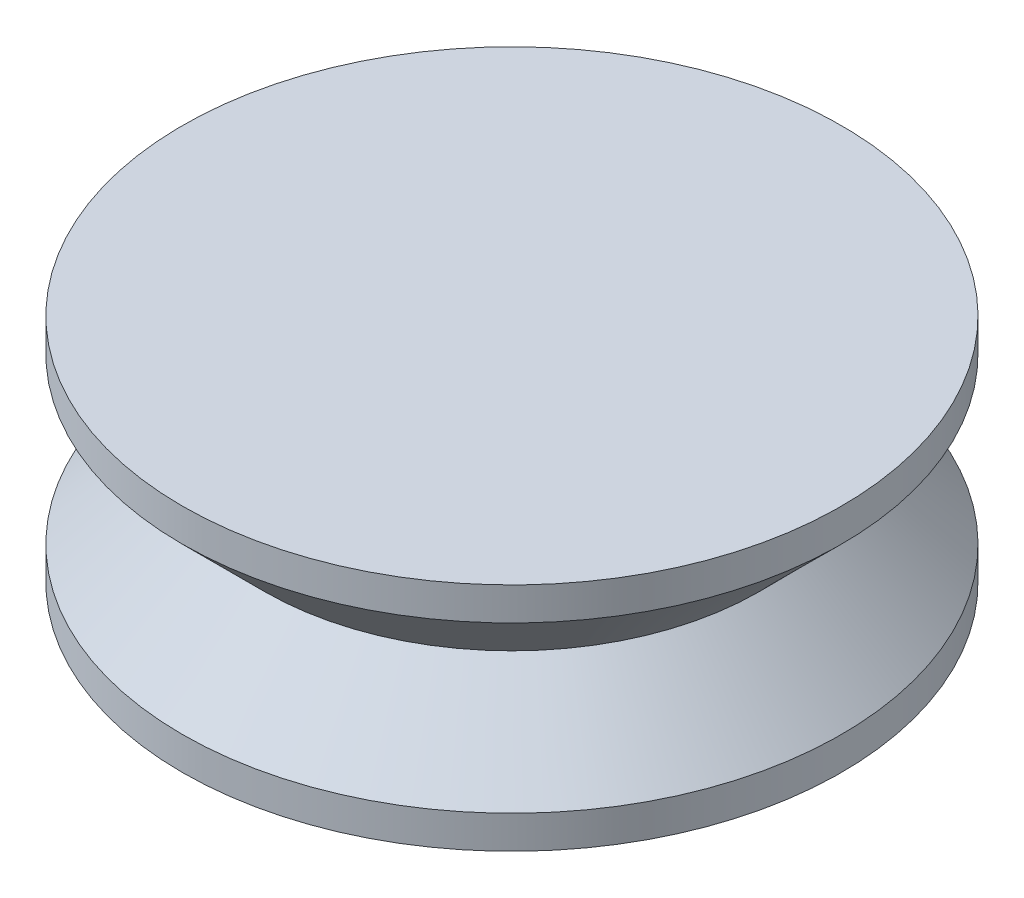
ISO-10303-21;
HEADER;
FILE_DESCRIPTION(('STEP AP214'),'2;1');
FILE_NAME('part.step','',(''),(''),'','','');
FILE_SCHEMA(('AUTOMOTIVE_DESIGN { 1 0 10303 214 1 1 1 1 }'));
ENDSEC;
DATA;
#1=APPLICATION_CONTEXT('core data for automotive mechanical design processes');
#2=APPLICATION_PROTOCOL_DEFINITION('international standard','automotive_design',2000,#1);
#3=PRODUCT_CONTEXT('',#1,'mechanical');
#4=PRODUCT('Part','Part','',(#3));
#5=PRODUCT_RELATED_PRODUCT_CATEGORY('part','',(#4));
#6=PRODUCT_DEFINITION_FORMATION('','',#4);
#7=PRODUCT_DEFINITION_CONTEXT('part definition',#1,'design');
#8=PRODUCT_DEFINITION('design','',#6,#7);
#9=PRODUCT_DEFINITION_SHAPE('','',#8);
#10=(LENGTH_UNIT() NAMED_UNIT(*) SI_UNIT(.MILLI.,.METRE.));
#11=(NAMED_UNIT(*) PLANE_ANGLE_UNIT() SI_UNIT($,.RADIAN.));
#12=(NAMED_UNIT(*) SI_UNIT($,.STERADIAN.) SOLID_ANGLE_UNIT());
#13=UNCERTAINTY_MEASURE_WITH_UNIT(LENGTH_MEASURE(1.E-05),#10,'distance_accuracy_value','');
#14=(GEOMETRIC_REPRESENTATION_CONTEXT(3) GLOBAL_UNCERTAINTY_ASSIGNED_CONTEXT((#13)) GLOBAL_UNIT_ASSIGNED_CONTEXT((#10,
#11,#12)) REPRESENTATION_CONTEXT('',''));
#15=CARTESIAN_POINT('',(0.,0.,0.));
#16=DIRECTION('',(0.,0.,1.));
#17=DIRECTION('',(1.,0.,0.));
#18=AXIS2_PLACEMENT_3D('',#15,#16,#17);
#19=CARTESIAN_POINT('',(12.7,4.445,0.));
#20=DIRECTION('',(0.,-1.,0.));
#21=DIRECTION('',(0.,0.,-1.));
#22=AXIS2_PLACEMENT_3D('',#19,#20,#21);
#23=PLANE('',#22);
#24=CARTESIAN_POINT('',(0.,4.445,0.));
#25=DIRECTION('',(0.,1.,0.));
#26=DIRECTION('',(0.,0.,1.));
#27=AXIS2_PLACEMENT_3D('',#24,#25,#26);
#28=CIRCLE('',#27,12.7);
#29=CARTESIAN_POINT('',(0.,4.445,12.7));
#30=VERTEX_POINT('',#29);
#31=EDGE_CURVE('E53',#30,#30,#28,.T.);
#32=ORIENTED_EDGE('',*,*,#31,.T.);
#33=EDGE_LOOP('',(#32));
#34=FACE_BOUND('',#33,.T.);
#35=ADVANCED_FACE('F34',(#34),#23,.F.);
#36=CARTESIAN_POINT('',(0.,-4.445,0.));
#37=DIRECTION('',(0.,1.,0.));
#38=DIRECTION('',(0.,0.,1.));
#39=AXIS2_PLACEMENT_3D('',#36,#37,#38);
#40=PLANE('',#39);
#41=CARTESIAN_POINT('',(0.,-4.445,0.));
#42=DIRECTION('',(0.,1.,0.));
#43=DIRECTION('',(0.,0.,1.));
#44=AXIS2_PLACEMENT_3D('',#41,#42,#43);
#45=CIRCLE('',#44,12.7);
#46=CARTESIAN_POINT('',(0.,-4.445,12.7));
#47=VERTEX_POINT('',#46);
#48=EDGE_CURVE('E10',#47,#47,#45,.T.);
#49=ORIENTED_EDGE('',*,*,#48,.F.);
#50=EDGE_LOOP('',(#49));
#51=FACE_BOUND('',#50,.T.);
#52=ADVANCED_FACE('F77',(#51),#40,.F.);
#53=CARTESIAN_POINT('',(0.,4.445,0.));
#54=DIRECTION('',(0.,1.,0.));
#55=DIRECTION('',(0.,0.,1.));
#56=AXIS2_PLACEMENT_3D('',#53,#54,#55);
#57=CYLINDRICAL_SURFACE('',#56,12.7);
#58=CARTESIAN_POINT('',(0.,-3.175,0.));
#59=DIRECTION('',(0.,1.,0.));
#60=DIRECTION('',(0.,0.,1.));
#61=AXIS2_PLACEMENT_3D('',#58,#59,#60);
#62=CIRCLE('',#61,12.7);
#63=CARTESIAN_POINT('',(0.,-3.175,12.7));
#64=VERTEX_POINT('',#63);
#65=EDGE_CURVE('E40',#64,#64,#62,.T.);
#66=ORIENTED_EDGE('',*,*,#65,.F.);
#67=EDGE_LOOP('',(#66));
#68=FACE_BOUND('',#67,.T.);
#69=ORIENTED_EDGE('',*,*,#48,.T.);
#70=EDGE_LOOP('',(#69));
#71=FACE_BOUND('',#70,.T.);
#72=ADVANCED_FACE('F72',(#68,#71),#57,.T.);
#73=CARTESIAN_POINT('',(0.,-3.175,0.));
#74=DIRECTION('',(0.,-1.,0.));
#75=DIRECTION('',(0.,0.,-1.));
#76=AXIS2_PLACEMENT_3D('',#73,#74,#75);
#77=CONICAL_SURFACE('',#76,12.7,0.785398163397449);
#78=CARTESIAN_POINT('',(0.,0.,0.));
#79=DIRECTION('',(0.,1.,0.));
#80=DIRECTION('',(0.,0.,1.));
#81=AXIS2_PLACEMENT_3D('',#78,#79,#80);
#82=CIRCLE('',#81,9.525);
#83=CARTESIAN_POINT('',(0.,0.,9.525));
#84=VERTEX_POINT('',#83);
#85=EDGE_CURVE('E44',#84,#84,#82,.T.);
#86=ORIENTED_EDGE('',*,*,#85,.F.);
#87=EDGE_LOOP('',(#86));
#88=FACE_BOUND('',#87,.T.);
#89=ORIENTED_EDGE('',*,*,#65,.T.);
#90=EDGE_LOOP('',(#89));
#91=FACE_BOUND('',#90,.T.);
#92=ADVANCED_FACE('F67',(#88,#91),#77,.T.);
#93=CARTESIAN_POINT('',(0.,0.,0.));
#94=DIRECTION('',(0.,1.,0.));
#95=DIRECTION('',(0.,0.,1.));
#96=AXIS2_PLACEMENT_3D('',#93,#94,#95);
#97=CONICAL_SURFACE('',#96,9.525,0.785398163397448);
#98=CARTESIAN_POINT('',(0.,3.175,0.));
#99=DIRECTION('',(0.,1.,0.));
#100=DIRECTION('',(0.,0.,1.));
#101=AXIS2_PLACEMENT_3D('',#98,#99,#100);
#102=CIRCLE('',#101,12.7);
#103=CARTESIAN_POINT('',(0.,3.175,12.7));
#104=VERTEX_POINT('',#103);
#105=EDGE_CURVE('E48',#104,#104,#102,.T.);
#106=ORIENTED_EDGE('',*,*,#105,.F.);
#107=EDGE_LOOP('',(#106));
#108=FACE_BOUND('',#107,.T.);
#109=ORIENTED_EDGE('',*,*,#85,.T.);
#110=EDGE_LOOP('',(#109));
#111=FACE_BOUND('',#110,.T.);
#112=ADVANCED_FACE('F61',(#108,#111),#97,.T.);
#113=CARTESIAN_POINT('',(0.,4.445,0.));
#114=DIRECTION('',(0.,1.,0.));
#115=DIRECTION('',(0.,0.,1.));
#116=AXIS2_PLACEMENT_3D('',#113,#114,#115);
#117=CYLINDRICAL_SURFACE('',#116,12.7);
#118=ORIENTED_EDGE('',*,*,#31,.F.);
#119=EDGE_LOOP('',(#118));
#120=FACE_BOUND('',#119,.T.);
#121=ORIENTED_EDGE('',*,*,#105,.T.);
#122=EDGE_LOOP('',(#121));
#123=FACE_BOUND('',#122,.T.);
#124=ADVANCED_FACE('F58',(#120,#123),#117,.T.);
#125=CLOSED_SHELL('',(#35,#52,#72,#92,#112,#124));
#126=MANIFOLD_SOLID_BREP('B2',#125);
#127=ADVANCED_BREP_SHAPE_REPRESENTATION('',(#18,#126),#14);
#128=SHAPE_DEFINITION_REPRESENTATION(#9,#127);
ENDSEC;
END-ISO-10303-21;
